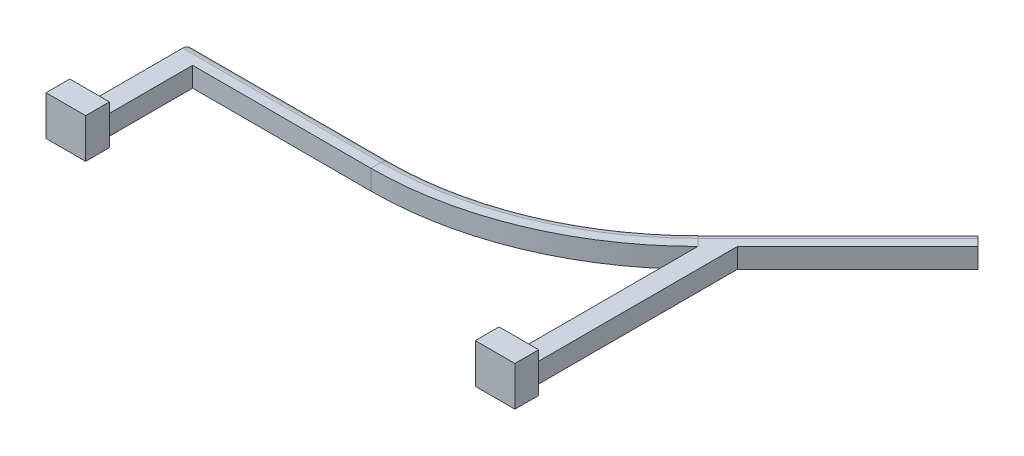
ISO-10303-21;
HEADER;
FILE_DESCRIPTION(('STEP AP214'),'2;1');
FILE_NAME('part.step','',(''),(''),'','','');
FILE_SCHEMA(('AUTOMOTIVE_DESIGN { 1 0 10303 214 1 1 1 1 }'));
ENDSEC;
DATA;
#1=APPLICATION_CONTEXT('core data for automotive mechanical design processes');
#2=APPLICATION_PROTOCOL_DEFINITION('international standard','automotive_design',2000,#1);
#3=PRODUCT_CONTEXT('',#1,'mechanical');
#4=PRODUCT('Part','Part','',(#3));
#5=PRODUCT_RELATED_PRODUCT_CATEGORY('part','',(#4));
#6=PRODUCT_DEFINITION_FORMATION('','',#4);
#7=PRODUCT_DEFINITION_CONTEXT('part definition',#1,'design');
#8=PRODUCT_DEFINITION('design','',#6,#7);
#9=PRODUCT_DEFINITION_SHAPE('','',#8);
#10=(LENGTH_UNIT() NAMED_UNIT(*) SI_UNIT(.MILLI.,.METRE.));
#11=(NAMED_UNIT(*) PLANE_ANGLE_UNIT() SI_UNIT($,.RADIAN.));
#12=(NAMED_UNIT(*) SI_UNIT($,.STERADIAN.) SOLID_ANGLE_UNIT());
#13=UNCERTAINTY_MEASURE_WITH_UNIT(LENGTH_MEASURE(1.E-05),#10,'distance_accuracy_value','');
#14=(GEOMETRIC_REPRESENTATION_CONTEXT(3) GLOBAL_UNCERTAINTY_ASSIGNED_CONTEXT((#13)) GLOBAL_UNIT_ASSIGNED_CONTEXT((#10,
#11,#12)) REPRESENTATION_CONTEXT('',''));
#15=CARTESIAN_POINT('',(0.,0.,0.));
#16=DIRECTION('',(0.,0.,1.));
#17=DIRECTION('',(1.,0.,0.));
#18=AXIS2_PLACEMENT_3D('',#15,#16,#17);
#19=CARTESIAN_POINT('',(108.33630944789,2.5,-21.6636905521099));
#20=DIRECTION('',(0.,1.,0.));
#21=DIRECTION('',(0.,0.,1.));
#22=AXIS2_PLACEMENT_3D('',#19,#20,#21);
#23=PLANE('',#22);
#24=DIRECTION('',(0.,0.,1.));
#25=VECTOR('',#24,1.);
#26=CARTESIAN_POINT('',(108.33630944789,2.5,32.));
#27=LINE('',#26,#25);
#28=CARTESIAN_POINT('',(108.33630944789,2.5,-21.6636905521099));
#29=VERTEX_POINT('',#28);
#30=CARTESIAN_POINT('',(108.33630944789,2.5,26.));
#31=VERTEX_POINT('',#30);
#32=EDGE_CURVE('E271',#29,#31,#27,.T.);
#33=ORIENTED_EDGE('',*,*,#32,.T.);
#34=DIRECTION('',(1.,0.,0.));
#35=VECTOR('',#34,1.);
#36=CARTESIAN_POINT('',(108.33630944789,2.5,26.));
#37=LINE('',#36,#35);
#38=CARTESIAN_POINT('',(113.33630944789,2.5,26.));
#39=VERTEX_POINT('',#38);
#40=EDGE_CURVE('E228',#31,#39,#37,.T.);
#41=ORIENTED_EDGE('',*,*,#40,.T.);
#42=DIRECTION('',(0.,0.,-1.));
#43=VECTOR('',#42,1.);
#44=CARTESIAN_POINT('',(113.33630944789,2.5,-26.6636905521099));
#45=LINE('',#44,#43);
#46=CARTESIAN_POINT('',(113.33630944789,2.5,-26.6636905521099));
#47=VERTEX_POINT('',#46);
#48=EDGE_CURVE('E273',#39,#47,#45,.T.);
#49=ORIENTED_EDGE('',*,*,#48,.T.);
#50=DIRECTION('',(0.707106781186546,0.,-0.707106781186549));
#51=VECTOR('',#50,1.);
#52=CARTESIAN_POINT('',(108.33630944789,2.5,-21.6636905521099));
#53=LINE('',#52,#51);
#54=CARTESIAN_POINT('',(143.691648507218,2.5,-57.0190296114374));
#55=VERTEX_POINT('',#54);
#56=EDGE_CURVE('E315',#47,#55,#53,.T.);
#57=ORIENTED_EDGE('',*,*,#56,.T.);
#58=DIRECTION('',(0.707106781186549,0.,0.707106781186546));
#59=VECTOR('',#58,1.);
#60=CARTESIAN_POINT('',(143.691648507218,2.5,-57.0190296114374));
#61=LINE('',#60,#59);
#62=CARTESIAN_POINT('',(141.923881554251,2.5,-58.7867965644037));
#63=VERTEX_POINT('',#62);
#64=EDGE_CURVE('E329',#63,#55,#61,.T.);
#65=ORIENTED_EDGE('',*,*,#64,.F.);
#66=DIRECTION('',(0.707106781186546,0.,-0.707106781186549));
#67=VECTOR('',#66,1.);
#68=CARTESIAN_POINT('',(106.568542494924,2.5,-23.4314575050763));
#69=LINE('',#68,#67);
#70=CARTESIAN_POINT('',(106.568542494924,2.5,-23.4314575050763));
#71=VERTEX_POINT('',#70);
#72=EDGE_CURVE('E347',#63,#71,#69,.F.);
#73=ORIENTED_EDGE('',*,*,#72,.T.);
#74=DIRECTION('',(0.707106781186549,0.,0.707106781186546));
#75=VECTOR('',#74,1.);
#76=CARTESIAN_POINT('',(108.33630944789,2.5,-21.6636905521099));
#77=LINE('',#76,#75);
#78=EDGE_CURVE('E319',#71,#29,#77,.T.);
#79=ORIENTED_EDGE('',*,*,#78,.T.);
#80=EDGE_LOOP('',(#33,#41,#49,#57,#65,#73,#79));
#81=FACE_BOUND('',#80,.T.);
#82=ADVANCED_FACE('F36',(#81),#23,.T.);
#83=CARTESIAN_POINT('',(108.33630944789,2.5,32.));
#84=DIRECTION('',(1.,0.,0.));
#85=DIRECTION('',(0.,0.,-1.));
#86=AXIS2_PLACEMENT_3D('',#83,#84,#85);
#87=PLANE('',#86);
#88=DIRECTION('',(0.,-1.,0.));
#89=VECTOR('',#88,1.);
#90=CARTESIAN_POINT('',(108.33630944789,2.5,26.));
#91=LINE('',#90,#89);
#92=CARTESIAN_POINT('',(108.33630944789,-2.5,26.));
#93=VERTEX_POINT('',#92);
#94=EDGE_CURVE('E51',#31,#93,#91,.T.);
#95=ORIENTED_EDGE('',*,*,#94,.F.);
#96=ORIENTED_EDGE('',*,*,#32,.F.);
#97=DIRECTION('',(0.,-1.,0.));
#98=VECTOR('',#97,1.);
#99=CARTESIAN_POINT('',(108.33630944789,2.5,-21.6636905521099));
#100=LINE('',#99,#98);
#101=CARTESIAN_POINT('',(108.33630944789,-2.5,-21.6636905521099));
#102=VERTEX_POINT('',#101);
#103=EDGE_CURVE('E301',#29,#102,#100,.T.);
#104=ORIENTED_EDGE('',*,*,#103,.T.);
#105=DIRECTION('',(0.,0.,1.));
#106=VECTOR('',#105,1.);
#107=CARTESIAN_POINT('',(108.33630944789,-2.5,32.));
#108=LINE('',#107,#106);
#109=EDGE_CURVE('E56',#102,#93,#108,.T.);
#110=ORIENTED_EDGE('',*,*,#109,.T.);
#111=EDGE_LOOP('',(#95,#96,#104,#110));
#112=FACE_BOUND('',#111,.T.);
#113=ADVANCED_FACE('F457',(#112),#87,.F.);
#114=CARTESIAN_POINT('',(113.33630944789,2.5,-26.6636905521099));
#115=DIRECTION('',(-1.,0.,0.));
#116=DIRECTION('',(0.,0.,1.));
#117=AXIS2_PLACEMENT_3D('',#114,#115,#116);
#118=PLANE('',#117);
#119=DIRECTION('',(0.,1.,0.));
#120=VECTOR('',#119,1.);
#121=CARTESIAN_POINT('',(113.33630944789,2.5,26.));
#122=LINE('',#121,#120);
#123=CARTESIAN_POINT('',(113.33630944789,-2.5,26.));
#124=VERTEX_POINT('',#123);
#125=EDGE_CURVE('E11',#124,#39,#122,.T.);
#126=ORIENTED_EDGE('',*,*,#125,.F.);
#127=DIRECTION('',(0.,0.,-1.));
#128=VECTOR('',#127,1.);
#129=CARTESIAN_POINT('',(113.33630944789,-2.5,-26.6636905521099));
#130=LINE('',#129,#128);
#131=CARTESIAN_POINT('',(113.33630944789,-2.5,-26.6636905521099));
#132=VERTEX_POINT('',#131);
#133=EDGE_CURVE('E274',#124,#132,#130,.T.);
#134=ORIENTED_EDGE('',*,*,#133,.T.);
#135=DIRECTION('',(0.,-1.,0.));
#136=VECTOR('',#135,1.);
#137=CARTESIAN_POINT('',(113.33630944789,2.5,-26.6636905521099));
#138=LINE('',#137,#136);
#139=EDGE_CURVE('E276',#47,#132,#138,.T.);
#140=ORIENTED_EDGE('',*,*,#139,.F.);
#141=ORIENTED_EDGE('',*,*,#48,.F.);
#142=EDGE_LOOP('',(#126,#134,#140,#141));
#143=FACE_BOUND('',#142,.T.);
#144=ADVANCED_FACE('F463',(#143),#118,.F.);
#145=CARTESIAN_POINT('',(0.,0.,0.));
#146=DIRECTION('',(1.,0.,0.));
#147=DIRECTION('',(0.,0.,-1.));
#148=AXIS2_PLACEMENT_3D('',#145,#146,#147);
#149=PLANE('',#148);
#150=DIRECTION('',(0.,-1.,0.));
#151=VECTOR('',#150,1.);
#152=CARTESIAN_POINT('',(0.,0.,26.));
#153=LINE('',#152,#151);
#154=CARTESIAN_POINT('',(0.,2.5,26.));
#155=VERTEX_POINT('',#154);
#156=CARTESIAN_POINT('',(0.,-2.5,26.));
#157=VERTEX_POINT('',#156);
#158=EDGE_CURVE('E268',#155,#157,#153,.T.);
#159=ORIENTED_EDGE('',*,*,#158,.F.);
#160=DIRECTION('',(0.,0.,1.));
#161=VECTOR('',#160,1.);
#162=CARTESIAN_POINT('',(0.,2.5,2.5));
#163=LINE('',#162,#161);
#164=CARTESIAN_POINT('',(0.,2.5,0.));
#165=VERTEX_POINT('',#164);
#166=EDGE_CURVE('E300',#165,#155,#163,.T.);
#167=ORIENTED_EDGE('',*,*,#166,.F.);
#168=CARTESIAN_POINT('',(0.,0.,0.));
#169=DIRECTION('',(1.,0.,0.));
#170=DIRECTION('',(0.,0.,-1.));
#171=AXIS2_PLACEMENT_3D('',#168,#169,#170);
#172=CIRCLE('',#171,2.5);
#173=CARTESIAN_POINT('',(0.,0.,-2.5));
#174=VERTEX_POINT('',#173);
#175=EDGE_CURVE('E353',#165,#174,#172,.F.);
#176=ORIENTED_EDGE('',*,*,#175,.T.);
#177=CARTESIAN_POINT('',(0.,0.,0.));
#178=DIRECTION('',(1.,0.,0.));
#179=DIRECTION('',(0.,0.,-1.));
#180=AXIS2_PLACEMENT_3D('',#177,#178,#179);
#181=CIRCLE('',#180,2.5);
#182=CARTESIAN_POINT('',(0.,-2.5,0.));
#183=VERTEX_POINT('',#182);
#184=EDGE_CURVE('E355',#174,#183,#181,.F.);
#185=ORIENTED_EDGE('',*,*,#184,.T.);
#186=DIRECTION('',(0.,0.,-1.));
#187=VECTOR('',#186,1.);
#188=CARTESIAN_POINT('',(0.,-2.5,2.5));
#189=LINE('',#188,#187);
#190=EDGE_CURVE('E320',#157,#183,#189,.T.);
#191=ORIENTED_EDGE('',*,*,#190,.F.);
#192=EDGE_LOOP('',(#159,#167,#176,#185,#191));
#193=FACE_BOUND('',#192,.T.);
#194=ADVANCED_FACE('F432',(#193),#149,.F.);
#195=CARTESIAN_POINT('',(0.,2.5,2.5));
#196=DIRECTION('',(0.,1.,0.));
#197=DIRECTION('',(0.,0.,1.));
#198=AXIS2_PLACEMENT_3D('',#195,#196,#197);
#199=PLANE('',#198);
#200=ORIENTED_EDGE('',*,*,#166,.T.);
#201=DIRECTION('',(1.,0.,0.));
#202=VECTOR('',#201,1.);
#203=CARTESIAN_POINT('',(0.,2.5,26.));
#204=LINE('',#203,#202);
#205=CARTESIAN_POINT('',(5.,2.5,26.));
#206=VERTEX_POINT('',#205);
#207=EDGE_CURVE('E259',#155,#206,#204,.T.);
#208=ORIENTED_EDGE('',*,*,#207,.T.);
#209=DIRECTION('',(0.,0.,-1.));
#210=VECTOR('',#209,1.);
#211=CARTESIAN_POINT('',(5.,2.5,32.));
#212=LINE('',#211,#210);
#213=CARTESIAN_POINT('',(5.,2.5,2.5));
#214=VERTEX_POINT('',#213);
#215=EDGE_CURVE('E283',#206,#214,#212,.T.);
#216=ORIENTED_EDGE('',*,*,#215,.T.);
#217=DIRECTION('',(1.,0.,0.));
#218=VECTOR('',#217,1.);
#219=CARTESIAN_POINT('',(0.,2.5,2.5));
#220=LINE('',#219,#218);
#221=CARTESIAN_POINT('',(50.,2.5,2.5));
#222=VERTEX_POINT('',#221);
#223=EDGE_CURVE('E296',#214,#222,#220,.T.);
#224=ORIENTED_EDGE('',*,*,#223,.T.);
#225=DIRECTION('',(0.,0.,1.));
#226=VECTOR('',#225,1.);
#227=CARTESIAN_POINT('',(50.,2.5,2.5));
#228=LINE('',#227,#226);
#229=CARTESIAN_POINT('',(50.,2.5,0.));
#230=VERTEX_POINT('',#229);
#231=EDGE_CURVE('E310',#230,#222,#228,.T.);
#232=ORIENTED_EDGE('',*,*,#231,.F.);
#233=DIRECTION('',(1.,0.,0.));
#234=VECTOR('',#233,1.);
#235=CARTESIAN_POINT('',(0.,2.5,0.));
#236=LINE('',#235,#234);
#237=EDGE_CURVE('E358',#230,#165,#236,.F.);
#238=ORIENTED_EDGE('',*,*,#237,.T.);
#239=EDGE_LOOP('',(#200,#208,#216,#224,#232,#238));
#240=FACE_BOUND('',#239,.T.);
#241=ADVANCED_FACE('F414',(#240),#199,.T.);
#242=CARTESIAN_POINT('',(5.,2.5,32.));
#243=DIRECTION('',(-1.,0.,0.));
#244=DIRECTION('',(0.,0.,1.));
#245=AXIS2_PLACEMENT_3D('',#242,#243,#244);
#246=PLANE('',#245);
#247=DIRECTION('',(0.,1.,0.));
#248=VECTOR('',#247,1.);
#249=CARTESIAN_POINT('',(5.,2.5,26.));
#250=LINE('',#249,#248);
#251=CARTESIAN_POINT('',(5.,-2.5,26.));
#252=VERTEX_POINT('',#251);
#253=EDGE_CURVE('E44',#252,#206,#250,.T.);
#254=ORIENTED_EDGE('',*,*,#253,.F.);
#255=DIRECTION('',(0.,0.,-1.));
#256=VECTOR('',#255,1.);
#257=CARTESIAN_POINT('',(5.,-2.5,32.));
#258=LINE('',#257,#256);
#259=CARTESIAN_POINT('',(5.,-2.5,2.5));
#260=VERTEX_POINT('',#259);
#261=EDGE_CURVE('E286',#252,#260,#258,.T.);
#262=ORIENTED_EDGE('',*,*,#261,.T.);
#263=DIRECTION('',(0.,-1.,0.));
#264=VECTOR('',#263,1.);
#265=CARTESIAN_POINT('',(5.,2.5,2.5));
#266=LINE('',#265,#264);
#267=EDGE_CURVE('E285',#214,#260,#266,.T.);
#268=ORIENTED_EDGE('',*,*,#267,.F.);
#269=ORIENTED_EDGE('',*,*,#215,.F.);
#270=EDGE_LOOP('',(#254,#262,#268,#269));
#271=FACE_BOUND('',#270,.T.);
#272=ADVANCED_FACE('F387',(#271),#246,.F.);
#273=CARTESIAN_POINT('',(108.33630944789,2.5,-21.6636905521099));
#274=DIRECTION('',(0.707106781186549,0.,0.707106781186546));
#275=DIRECTION('',(0.707106781186546,0.,-0.707106781186549));
#276=AXIS2_PLACEMENT_3D('',#273,#274,#275);
#277=PLANE('',#276);
#278=ORIENTED_EDGE('',*,*,#56,.F.);
#279=ORIENTED_EDGE('',*,*,#139,.T.);
#280=DIRECTION('',(0.707106781186546,0.,-0.707106781186549));
#281=VECTOR('',#280,1.);
#282=CARTESIAN_POINT('',(108.33630944789,-2.5,-21.6636905521099));
#283=LINE('',#282,#281);
#284=CARTESIAN_POINT('',(143.691648507218,-2.5,-57.0190296114374));
#285=VERTEX_POINT('',#284);
#286=EDGE_CURVE('E314',#132,#285,#283,.T.);
#287=ORIENTED_EDGE('',*,*,#286,.T.);
#288=DIRECTION('',(0.,-1.,0.));
#289=VECTOR('',#288,1.);
#290=CARTESIAN_POINT('',(143.691648507218,2.5,-57.0190296114374));
#291=LINE('',#290,#289);
#292=EDGE_CURVE('E311',#55,#285,#291,.T.);
#293=ORIENTED_EDGE('',*,*,#292,.F.);
#294=EDGE_LOOP('',(#278,#279,#287,#293));
#295=FACE_BOUND('',#294,.T.);
#296=ADVANCED_FACE('F498',(#295),#277,.T.);
#297=CARTESIAN_POINT('',(0.,2.5,2.5));
#298=DIRECTION('',(0.,0.,1.));
#299=DIRECTION('',(0.,-1.,0.));
#300=AXIS2_PLACEMENT_3D('',#297,#298,#299);
#301=PLANE('',#300);
#302=ORIENTED_EDGE('',*,*,#223,.F.);
#303=ORIENTED_EDGE('',*,*,#267,.T.);
#304=DIRECTION('',(1.,0.,0.));
#305=VECTOR('',#304,1.);
#306=CARTESIAN_POINT('',(0.,-2.5,2.5));
#307=LINE('',#306,#305);
#308=CARTESIAN_POINT('',(50.,-2.5,2.5));
#309=VERTEX_POINT('',#308);
#310=EDGE_CURVE('E295',#260,#309,#307,.T.);
#311=ORIENTED_EDGE('',*,*,#310,.T.);
#312=DIRECTION('',(0.,-1.,0.));
#313=VECTOR('',#312,1.);
#314=CARTESIAN_POINT('',(50.,2.5,2.5));
#315=LINE('',#314,#313);
#316=EDGE_CURVE('E292',#222,#309,#315,.T.);
#317=ORIENTED_EDGE('',*,*,#316,.F.);
#318=EDGE_LOOP('',(#302,#303,#311,#317));
#319=FACE_BOUND('',#318,.T.);
#320=ADVANCED_FACE('F398',(#319),#301,.T.);
#321=CARTESIAN_POINT('',(141.923881554251,0.,-58.7867965644037));
#322=DIRECTION('',(0.707106781186546,0.,-0.707106781186549));
#323=DIRECTION('',(-0.707106781186549,0.,-0.707106781186546));
#324=AXIS2_PLACEMENT_3D('',#321,#322,#323);
#325=PLANE('',#324);
#326=DIRECTION('',(-0.707106781186549,0.,-0.707106781186546));
#327=VECTOR('',#326,1.);
#328=CARTESIAN_POINT('',(143.691648507218,-2.5,-57.0190296114374));
#329=LINE('',#328,#327);
#330=CARTESIAN_POINT('',(141.923881554251,-2.5,-58.7867965644037));
#331=VERTEX_POINT('',#330);
#332=EDGE_CURVE('E317',#285,#331,#329,.T.);
#333=ORIENTED_EDGE('',*,*,#332,.T.);
#334=CARTESIAN_POINT('',(141.923881554251,0.,-58.7867965644037));
#335=DIRECTION('',(0.707106781186546,0.,-0.707106781186549));
#336=DIRECTION('',(-0.707106781186549,0.,-0.707106781186546));
#337=AXIS2_PLACEMENT_3D('',#334,#335,#336);
#338=CIRCLE('',#337,2.5);
#339=CARTESIAN_POINT('',(140.156114601285,0.,-60.5545635173701));
#340=VERTEX_POINT('',#339);
#341=EDGE_CURVE('E343',#331,#340,#338,.T.);
#342=ORIENTED_EDGE('',*,*,#341,.T.);
#343=CARTESIAN_POINT('',(141.923881554251,0.,-58.7867965644037));
#344=DIRECTION('',(0.707106781186546,0.,-0.707106781186549));
#345=DIRECTION('',(-0.707106781186549,0.,-0.707106781186546));
#346=AXIS2_PLACEMENT_3D('',#343,#344,#345);
#347=CIRCLE('',#346,2.5);
#348=EDGE_CURVE('E341',#340,#63,#347,.T.);
#349=ORIENTED_EDGE('',*,*,#348,.T.);
#350=ORIENTED_EDGE('',*,*,#64,.T.);
#351=ORIENTED_EDGE('',*,*,#292,.T.);
#352=EDGE_LOOP('',(#333,#342,#349,#350,#351));
#353=FACE_BOUND('',#352,.T.);
#354=ADVANCED_FACE('F468',(#353),#325,.T.);
#355=CARTESIAN_POINT('',(0.,-2.5,2.5));
#356=DIRECTION('',(0.,-1.,0.));
#357=DIRECTION('',(0.,0.,-1.));
#358=AXIS2_PLACEMENT_3D('',#355,#356,#357);
#359=PLANE('',#358);
#360=DIRECTION('',(1.,0.,0.));
#361=VECTOR('',#360,1.);
#362=CARTESIAN_POINT('',(0.,-2.5,32.));
#363=LINE('',#362,#361);
#364=CARTESIAN_POINT('',(-2.5,-2.5,32.));
#365=VERTEX_POINT('',#364);
#366=CARTESIAN_POINT('',(7.5,-2.5,32.));
#367=VERTEX_POINT('',#366);
#368=EDGE_CURVE('E282',#365,#367,#363,.T.);
#369=ORIENTED_EDGE('',*,*,#368,.F.);
#370=DIRECTION('',(0.,0.,1.));
#371=VECTOR('',#370,1.);
#372=CARTESIAN_POINT('',(-2.5,-2.5,26.));
#373=LINE('',#372,#371);
#374=CARTESIAN_POINT('',(-2.5,-2.5,26.));
#375=VERTEX_POINT('',#374);
#376=EDGE_CURVE('E249',#375,#365,#373,.T.);
#377=ORIENTED_EDGE('',*,*,#376,.F.);
#378=DIRECTION('',(1.,0.,0.));
#379=VECTOR('',#378,1.);
#380=CARTESIAN_POINT('',(-2.5,-2.5,26.));
#381=LINE('',#380,#379);
#382=EDGE_CURVE('E240',#375,#157,#381,.T.);
#383=ORIENTED_EDGE('',*,*,#382,.T.);
#384=ORIENTED_EDGE('',*,*,#190,.T.);
#385=DIRECTION('',(1.,0.,0.));
#386=VECTOR('',#385,1.);
#387=CARTESIAN_POINT('',(0.,-2.5,0.));
#388=LINE('',#387,#386);
#389=CARTESIAN_POINT('',(50.,-2.5,0.));
#390=VERTEX_POINT('',#389);
#391=EDGE_CURVE('E351',#183,#390,#388,.T.);
#392=ORIENTED_EDGE('',*,*,#391,.T.);
#393=DIRECTION('',(0.,0.,-1.));
#394=VECTOR('',#393,1.);
#395=CARTESIAN_POINT('',(50.,-2.5,2.5));
#396=LINE('',#395,#394);
#397=EDGE_CURVE('E298',#309,#390,#396,.T.);
#398=ORIENTED_EDGE('',*,*,#397,.F.);
#399=ORIENTED_EDGE('',*,*,#310,.F.);
#400=ORIENTED_EDGE('',*,*,#261,.F.);
#401=CARTESIAN_POINT('',(7.5,-2.5,26.));
#402=VERTEX_POINT('',#401);
#403=EDGE_CURVE('E238',#252,#402,#381,.T.);
#404=ORIENTED_EDGE('',*,*,#403,.T.);
#405=DIRECTION('',(0.,0.,1.));
#406=VECTOR('',#405,1.);
#407=CARTESIAN_POINT('',(7.5,-2.5,26.));
#408=LINE('',#407,#406);
#409=EDGE_CURVE('E262',#402,#367,#408,.T.);
#410=ORIENTED_EDGE('',*,*,#409,.T.);
#411=EDGE_LOOP('',(#369,#377,#383,#384,#392,#398,#399,#400,#404,#410));
#412=FACE_BOUND('',#411,.T.);
#413=ADVANCED_FACE('F391',(#412),#359,.T.);
#414=CARTESIAN_POINT('',(50.,0.,-80.));
#415=DIRECTION('',(0.,1.,0.));
#416=DIRECTION('',(0.,0.,1.));
#417=AXIS2_PLACEMENT_3D('',#414,#415,#416);
#418=CYLINDRICAL_SURFACE('',#417,82.5);
#419=CARTESIAN_POINT('',(50.,-2.5,-80.));
#420=DIRECTION('',(0.,1.,0.));
#421=DIRECTION('',(0.,0.,1.));
#422=AXIS2_PLACEMENT_3D('',#419,#420,#421);
#423=CIRCLE('',#422,82.5);
#424=EDGE_CURVE('E303',#309,#102,#423,.T.);
#425=ORIENTED_EDGE('',*,*,#424,.T.);
#426=ORIENTED_EDGE('',*,*,#103,.F.);
#427=CARTESIAN_POINT('',(50.,2.5,-80.));
#428=DIRECTION('',(0.,1.,0.));
#429=DIRECTION('',(0.,0.,1.));
#430=AXIS2_PLACEMENT_3D('',#427,#428,#429);
#431=CIRCLE('',#430,82.5);
#432=EDGE_CURVE('E304',#222,#29,#431,.T.);
#433=ORIENTED_EDGE('',*,*,#432,.F.);
#434=ORIENTED_EDGE('',*,*,#316,.T.);
#435=EDGE_LOOP('',(#425,#426,#433,#434));
#436=FACE_BOUND('',#435,.T.);
#437=ADVANCED_FACE('F405',(#436),#418,.T.);
#438=CARTESIAN_POINT('',(50.,-2.5,2.50000000000001));
#439=DIRECTION('',(0.,-1.,0.));
#440=DIRECTION('',(0.,0.,-1.));
#441=AXIS2_PLACEMENT_3D('',#438,#439,#440);
#442=PLANE('',#441);
#443=ORIENTED_EDGE('',*,*,#397,.T.);
#444=CARTESIAN_POINT('',(50.,-2.5,-80.));
#445=DIRECTION('',(0.,-1.,0.));
#446=DIRECTION('',(0.,0.,-1.));
#447=AXIS2_PLACEMENT_3D('',#444,#445,#446);
#448=CIRCLE('',#447,80.);
#449=CARTESIAN_POINT('',(106.568542494924,-2.5,-23.4314575050763));
#450=VERTEX_POINT('',#449);
#451=EDGE_CURVE('E345',#390,#450,#448,.F.);
#452=ORIENTED_EDGE('',*,*,#451,.T.);
#453=DIRECTION('',(-0.707106781186549,0.,-0.707106781186546));
#454=VECTOR('',#453,1.);
#455=CARTESIAN_POINT('',(108.33630944789,-2.5,-21.6636905521099));
#456=LINE('',#455,#454);
#457=EDGE_CURVE('E307',#102,#450,#456,.T.);
#458=ORIENTED_EDGE('',*,*,#457,.F.);
#459=ORIENTED_EDGE('',*,*,#424,.F.);
#460=EDGE_LOOP('',(#443,#452,#458,#459));
#461=FACE_BOUND('',#460,.T.);
#462=ADVANCED_FACE('F401',(#461),#442,.T.);
#463=CARTESIAN_POINT('',(50.,2.5,2.50000000000001));
#464=DIRECTION('',(0.,1.,0.));
#465=DIRECTION('',(0.,0.,1.));
#466=AXIS2_PLACEMENT_3D('',#463,#464,#465);
#467=PLANE('',#466);
#468=ORIENTED_EDGE('',*,*,#78,.F.);
#469=CARTESIAN_POINT('',(50.,2.5,-80.));
#470=DIRECTION('',(0.,1.,0.));
#471=DIRECTION('',(0.,0.,1.));
#472=AXIS2_PLACEMENT_3D('',#469,#470,#471);
#473=CIRCLE('',#472,80.);
#474=EDGE_CURVE('E349',#71,#230,#473,.F.);
#475=ORIENTED_EDGE('',*,*,#474,.T.);
#476=ORIENTED_EDGE('',*,*,#231,.T.);
#477=ORIENTED_EDGE('',*,*,#432,.T.);
#478=EDGE_LOOP('',(#468,#475,#476,#477));
#479=FACE_BOUND('',#478,.T.);
#480=ADVANCED_FACE('F409',(#479),#467,.T.);
#481=CARTESIAN_POINT('',(108.33630944789,-2.5,-21.6636905521099));
#482=DIRECTION('',(0.,-1.,0.));
#483=DIRECTION('',(0.,0.,-1.));
#484=AXIS2_PLACEMENT_3D('',#481,#482,#483);
#485=PLANE('',#484);
#486=DIRECTION('',(1.,0.,0.));
#487=VECTOR('',#486,1.);
#488=CARTESIAN_POINT('',(105.83630944789,-2.5,26.));
#489=LINE('',#488,#487);
#490=CARTESIAN_POINT('',(105.83630944789,-2.5,26.));
#491=VERTEX_POINT('',#490);
#492=EDGE_CURVE('E192',#491,#93,#489,.T.);
#493=ORIENTED_EDGE('',*,*,#492,.T.);
#494=ORIENTED_EDGE('',*,*,#109,.F.);
#495=ORIENTED_EDGE('',*,*,#457,.T.);
#496=DIRECTION('',(0.707106781186546,0.,-0.707106781186549));
#497=VECTOR('',#496,1.);
#498=CARTESIAN_POINT('',(106.568542494924,-2.5,-23.4314575050763));
#499=LINE('',#498,#497);
#500=EDGE_CURVE('E338',#450,#331,#499,.T.);
#501=ORIENTED_EDGE('',*,*,#500,.T.);
#502=ORIENTED_EDGE('',*,*,#332,.F.);
#503=ORIENTED_EDGE('',*,*,#286,.F.);
#504=ORIENTED_EDGE('',*,*,#133,.F.);
#505=CARTESIAN_POINT('',(115.83630944789,-2.5,26.));
#506=VERTEX_POINT('',#505);
#507=EDGE_CURVE('E210',#124,#506,#489,.T.);
#508=ORIENTED_EDGE('',*,*,#507,.T.);
#509=DIRECTION('',(0.,0.,1.));
#510=VECTOR('',#509,1.);
#511=CARTESIAN_POINT('',(115.83630944789,-2.5,26.));
#512=LINE('',#511,#510);
#513=CARTESIAN_POINT('',(115.83630944789,-2.5,32.));
#514=VERTEX_POINT('',#513);
#515=EDGE_CURVE('E199',#506,#514,#512,.T.);
#516=ORIENTED_EDGE('',*,*,#515,.T.);
#517=DIRECTION('',(1.,0.,0.));
#518=VECTOR('',#517,1.);
#519=CARTESIAN_POINT('',(113.33630944789,-2.5,32.));
#520=LINE('',#519,#518);
#521=CARTESIAN_POINT('',(105.83630944789,-2.5,32.));
#522=VERTEX_POINT('',#521);
#523=EDGE_CURVE('E194',#522,#514,#520,.T.);
#524=ORIENTED_EDGE('',*,*,#523,.F.);
#525=DIRECTION('',(0.,0.,1.));
#526=VECTOR('',#525,1.);
#527=CARTESIAN_POINT('',(105.83630944789,-2.5,26.));
#528=LINE('',#527,#526);
#529=EDGE_CURVE('E189',#491,#522,#528,.T.);
#530=ORIENTED_EDGE('',*,*,#529,.F.);
#531=EDGE_LOOP('',(#493,#494,#495,#501,#502,#503,#504,#508,#516,#524,#530));
#532=FACE_BOUND('',#531,.T.);
#533=ADVANCED_FACE('F191',(#532),#485,.T.);
#534=CARTESIAN_POINT('',(0.,0.,0.));
#535=DIRECTION('',(1.,0.,0.));
#536=DIRECTION('',(0.,0.,-1.));
#537=AXIS2_PLACEMENT_3D('',#534,#535,#536);
#538=CYLINDRICAL_SURFACE('',#537,2.5);
#539=ORIENTED_EDGE('',*,*,#175,.F.);
#540=ORIENTED_EDGE('',*,*,#237,.F.);
#541=CARTESIAN_POINT('',(50.,0.,0.));
#542=DIRECTION('',(1.,0.,0.));
#543=DIRECTION('',(0.,0.,-1.));
#544=AXIS2_PLACEMENT_3D('',#541,#542,#543);
#545=CIRCLE('',#544,2.5);
#546=CARTESIAN_POINT('',(50.,0.,-2.49999999999999));
#547=VERTEX_POINT('',#546);
#548=EDGE_CURVE('E322',#547,#230,#545,.T.);
#549=ORIENTED_EDGE('',*,*,#548,.F.);
#550=DIRECTION('',(1.,0.,0.));
#551=VECTOR('',#550,1.);
#552=CARTESIAN_POINT('',(0.,0.,-2.5));
#553=LINE('',#552,#551);
#554=EDGE_CURVE('E374',#174,#547,#553,.T.);
#555=ORIENTED_EDGE('',*,*,#554,.F.);
#556=EDGE_LOOP('',(#539,#540,#549,#555));
#557=FACE_BOUND('',#556,.T.);
#558=ADVANCED_FACE('F38',(#557),#538,.T.);
#559=CARTESIAN_POINT('',(50.,0.,-80.));
#560=DIRECTION('',(0.,1.,0.));
#561=DIRECTION('',(0.,0.,1.));
#562=AXIS2_PLACEMENT_3D('',#559,#560,#561);
#563=TOROIDAL_SURFACE('',#562,80.,2.5);
#564=ORIENTED_EDGE('',*,*,#548,.T.);
#565=ORIENTED_EDGE('',*,*,#474,.F.);
#566=CARTESIAN_POINT('',(106.568542494924,0.,-23.4314575050763));
#567=DIRECTION('',(0.707106781186546,0.,-0.70710678118655));
#568=DIRECTION('',(-0.70710678118655,0.,-0.707106781186546));
#569=AXIS2_PLACEMENT_3D('',#566,#567,#568);
#570=CIRCLE('',#569,2.5);
#571=CARTESIAN_POINT('',(104.800775541958,0.,-25.1992244580427));
#572=VERTEX_POINT('',#571);
#573=EDGE_CURVE('E371',#572,#71,#570,.T.);
#574=ORIENTED_EDGE('',*,*,#573,.F.);
#575=CARTESIAN_POINT('',(50.,0.,-80.));
#576=DIRECTION('',(0.,1.,0.));
#577=DIRECTION('',(0.,0.,1.));
#578=AXIS2_PLACEMENT_3D('',#575,#576,#577);
#579=CIRCLE('',#578,77.5);
#580=EDGE_CURVE('E368',#547,#572,#579,.T.);
#581=ORIENTED_EDGE('',*,*,#580,.F.);
#582=EDGE_LOOP('',(#564,#565,#574,#581));
#583=FACE_BOUND('',#582,.T.);
#584=ADVANCED_FACE('F421',(#583),#563,.T.);
#585=CARTESIAN_POINT('',(0.,0.,0.));
#586=DIRECTION('',(1.,0.,0.));
#587=DIRECTION('',(0.,0.,-1.));
#588=AXIS2_PLACEMENT_3D('',#585,#586,#587);
#589=CYLINDRICAL_SURFACE('',#588,2.5);
#590=ORIENTED_EDGE('',*,*,#184,.F.);
#591=ORIENTED_EDGE('',*,*,#554,.T.);
#592=CARTESIAN_POINT('',(50.,0.,0.));
#593=DIRECTION('',(1.,0.,0.));
#594=DIRECTION('',(0.,0.,-1.));
#595=AXIS2_PLACEMENT_3D('',#592,#593,#594);
#596=CIRCLE('',#595,2.5);
#597=EDGE_CURVE('E365',#390,#547,#596,.T.);
#598=ORIENTED_EDGE('',*,*,#597,.F.);
#599=ORIENTED_EDGE('',*,*,#391,.F.);
#600=EDGE_LOOP('',(#590,#591,#598,#599));
#601=FACE_BOUND('',#600,.T.);
#602=ADVANCED_FACE('F430',(#601),#589,.T.);
#603=CARTESIAN_POINT('',(106.568542494924,0.,-23.4314575050763));
#604=DIRECTION('',(0.707106781186546,0.,-0.707106781186549));
#605=DIRECTION('',(-0.707106781186549,0.,-0.707106781186546));
#606=AXIS2_PLACEMENT_3D('',#603,#604,#605);
#607=CYLINDRICAL_SURFACE('',#606,2.5);
#608=ORIENTED_EDGE('',*,*,#72,.F.);
#609=ORIENTED_EDGE('',*,*,#348,.F.);
#610=DIRECTION('',(0.707106781186546,0.,-0.707106781186549));
#611=VECTOR('',#610,1.);
#612=CARTESIAN_POINT('',(104.800775541958,0.,-25.1992244580427));
#613=LINE('',#612,#611);
#614=EDGE_CURVE('E362',#572,#340,#613,.T.);
#615=ORIENTED_EDGE('',*,*,#614,.F.);
#616=ORIENTED_EDGE('',*,*,#573,.T.);
#617=EDGE_LOOP('',(#608,#609,#615,#616));
#618=FACE_BOUND('',#617,.T.);
#619=ADVANCED_FACE('F480',(#618),#607,.T.);
#620=CARTESIAN_POINT('',(50.,0.,-80.));
#621=DIRECTION('',(0.,-1.,0.));
#622=DIRECTION('',(0.,0.,-1.));
#623=AXIS2_PLACEMENT_3D('',#620,#621,#622);
#624=TOROIDAL_SURFACE('',#623,80.,2.5);
#625=ORIENTED_EDGE('',*,*,#597,.T.);
#626=ORIENTED_EDGE('',*,*,#580,.T.);
#627=CARTESIAN_POINT('',(106.568542494924,0.,-23.4314575050763));
#628=DIRECTION('',(0.707106781186545,0.,-0.70710678118655));
#629=DIRECTION('',(-0.70710678118655,0.,-0.707106781186545));
#630=AXIS2_PLACEMENT_3D('',#627,#628,#629);
#631=CIRCLE('',#630,2.5);
#632=EDGE_CURVE('E291',#450,#572,#631,.T.);
#633=ORIENTED_EDGE('',*,*,#632,.F.);
#634=ORIENTED_EDGE('',*,*,#451,.F.);
#635=EDGE_LOOP('',(#625,#626,#633,#634));
#636=FACE_BOUND('',#635,.T.);
#637=ADVANCED_FACE('F426',(#636),#624,.T.);
#638=CARTESIAN_POINT('',(106.568542494924,0.,-23.4314575050763));
#639=DIRECTION('',(0.707106781186546,0.,-0.707106781186549));
#640=DIRECTION('',(-0.707106781186549,0.,-0.707106781186546));
#641=AXIS2_PLACEMENT_3D('',#638,#639,#640);
#642=CYLINDRICAL_SURFACE('',#641,2.5);
#643=ORIENTED_EDGE('',*,*,#632,.T.);
#644=ORIENTED_EDGE('',*,*,#614,.T.);
#645=ORIENTED_EDGE('',*,*,#341,.F.);
#646=ORIENTED_EDGE('',*,*,#500,.F.);
#647=EDGE_LOOP('',(#643,#644,#645,#646));
#648=FACE_BOUND('',#647,.T.);
#649=ADVANCED_FACE('F474',(#648),#642,.T.);
#650=CARTESIAN_POINT('',(0.,2.5,32.));
#651=DIRECTION('',(0.,0.,-1.));
#652=DIRECTION('',(-1.,0.,0.));
#653=AXIS2_PLACEMENT_3D('',#650,#651,#652);
#654=PLANE('',#653);
#655=DIRECTION('',(0.,-1.,0.));
#656=VECTOR('',#655,1.);
#657=CARTESIAN_POINT('',(-2.5,7.5,32.));
#658=LINE('',#657,#656);
#659=CARTESIAN_POINT('',(-2.5,7.5,32.));
#660=VERTEX_POINT('',#659);
#661=EDGE_CURVE('E234',#660,#365,#658,.T.);
#662=ORIENTED_EDGE('',*,*,#661,.T.);
#663=ORIENTED_EDGE('',*,*,#368,.T.);
#664=DIRECTION('',(0.,1.,0.));
#665=VECTOR('',#664,1.);
#666=CARTESIAN_POINT('',(7.5,7.5,32.));
#667=LINE('',#666,#665);
#668=CARTESIAN_POINT('',(7.5,7.5,32.));
#669=VERTEX_POINT('',#668);
#670=EDGE_CURVE('E252',#367,#669,#667,.T.);
#671=ORIENTED_EDGE('',*,*,#670,.T.);
#672=DIRECTION('',(-1.,0.,0.));
#673=VECTOR('',#672,1.);
#674=CARTESIAN_POINT('',(-2.5,7.5,32.));
#675=LINE('',#674,#673);
#676=EDGE_CURVE('E239',#669,#660,#675,.T.);
#677=ORIENTED_EDGE('',*,*,#676,.T.);
#678=EDGE_LOOP('',(#662,#663,#671,#677));
#679=FACE_BOUND('',#678,.T.);
#680=ADVANCED_FACE('F439',(#679),#654,.F.);
#681=CARTESIAN_POINT('',(113.33630944789,2.5,32.));
#682=DIRECTION('',(0.,0.,-1.));
#683=DIRECTION('',(-1.,0.,0.));
#684=AXIS2_PLACEMENT_3D('',#681,#682,#683);
#685=PLANE('',#684);
#686=DIRECTION('',(0.,-1.,0.));
#687=VECTOR('',#686,1.);
#688=CARTESIAN_POINT('',(105.83630944789,7.5,32.));
#689=LINE('',#688,#687);
#690=CARTESIAN_POINT('',(105.83630944789,7.5,32.));
#691=VERTEX_POINT('',#690);
#692=EDGE_CURVE('E223',#691,#522,#689,.T.);
#693=ORIENTED_EDGE('',*,*,#692,.T.);
#694=ORIENTED_EDGE('',*,*,#523,.T.);
#695=DIRECTION('',(0.,1.,0.));
#696=VECTOR('',#695,1.);
#697=CARTESIAN_POINT('',(115.83630944789,7.5,32.));
#698=LINE('',#697,#696);
#699=CARTESIAN_POINT('',(115.83630944789,7.5,32.));
#700=VERTEX_POINT('',#699);
#701=EDGE_CURVE('E217',#514,#700,#698,.T.);
#702=ORIENTED_EDGE('',*,*,#701,.T.);
#703=DIRECTION('',(-1.,0.,0.));
#704=VECTOR('',#703,1.);
#705=CARTESIAN_POINT('',(105.83630944789,7.5,32.));
#706=LINE('',#705,#704);
#707=EDGE_CURVE('E214',#700,#691,#706,.T.);
#708=ORIENTED_EDGE('',*,*,#707,.T.);
#709=EDGE_LOOP('',(#693,#694,#702,#708));
#710=FACE_BOUND('',#709,.T.);
#711=ADVANCED_FACE('F585',(#710),#685,.F.);
#712=CARTESIAN_POINT('',(0.,0.,26.));
#713=DIRECTION('',(0.,0.,1.));
#714=DIRECTION('',(1.,0.,0.));
#715=AXIS2_PLACEMENT_3D('',#712,#713,#714);
#716=PLANE('',#715);
#717=ORIENTED_EDGE('',*,*,#207,.F.);
#718=ORIENTED_EDGE('',*,*,#158,.T.);
#719=ORIENTED_EDGE('',*,*,#382,.F.);
#720=DIRECTION('',(0.,-1.,0.));
#721=VECTOR('',#720,1.);
#722=CARTESIAN_POINT('',(-2.5,7.5,26.));
#723=LINE('',#722,#721);
#724=CARTESIAN_POINT('',(-2.5,7.5,26.));
#725=VERTEX_POINT('',#724);
#726=EDGE_CURVE('E235',#725,#375,#723,.T.);
#727=ORIENTED_EDGE('',*,*,#726,.F.);
#728=DIRECTION('',(-1.,0.,0.));
#729=VECTOR('',#728,1.);
#730=CARTESIAN_POINT('',(-2.5,7.5,26.));
#731=LINE('',#730,#729);
#732=CARTESIAN_POINT('',(7.5,7.5,26.));
#733=VERTEX_POINT('',#732);
#734=EDGE_CURVE('E246',#733,#725,#731,.T.);
#735=ORIENTED_EDGE('',*,*,#734,.F.);
#736=DIRECTION('',(0.,1.,0.));
#737=VECTOR('',#736,1.);
#738=CARTESIAN_POINT('',(7.5,7.5,26.));
#739=LINE('',#738,#737);
#740=EDGE_CURVE('E243',#402,#733,#739,.T.);
#741=ORIENTED_EDGE('',*,*,#740,.F.);
#742=ORIENTED_EDGE('',*,*,#403,.F.);
#743=ORIENTED_EDGE('',*,*,#253,.T.);
#744=EDGE_LOOP('',(#717,#718,#719,#727,#735,#741,#742,#743));
#745=FACE_BOUND('',#744,.T.);
#746=ADVANCED_FACE('F382',(#745),#716,.F.);
#747=CARTESIAN_POINT('',(-2.5,7.5,26.));
#748=DIRECTION('',(-1.,0.,0.));
#749=DIRECTION('',(0.,-1.,0.));
#750=AXIS2_PLACEMENT_3D('',#747,#748,#749);
#751=PLANE('',#750);
#752=ORIENTED_EDGE('',*,*,#661,.F.);
#753=DIRECTION('',(0.,0.,1.));
#754=VECTOR('',#753,1.);
#755=CARTESIAN_POINT('',(-2.5,7.5,26.));
#756=LINE('',#755,#754);
#757=EDGE_CURVE('E257',#725,#660,#756,.T.);
#758=ORIENTED_EDGE('',*,*,#757,.F.);
#759=ORIENTED_EDGE('',*,*,#726,.T.);
#760=ORIENTED_EDGE('',*,*,#376,.T.);
#761=EDGE_LOOP('',(#752,#758,#759,#760));
#762=FACE_BOUND('',#761,.T.);
#763=ADVANCED_FACE('F437',(#762),#751,.T.);
#764=CARTESIAN_POINT('',(-2.5,7.5,26.));
#765=DIRECTION('',(0.,1.,0.));
#766=DIRECTION('',(0.,0.,1.));
#767=AXIS2_PLACEMENT_3D('',#764,#765,#766);
#768=PLANE('',#767);
#769=ORIENTED_EDGE('',*,*,#676,.F.);
#770=DIRECTION('',(0.,0.,1.));
#771=VECTOR('',#770,1.);
#772=CARTESIAN_POINT('',(7.5,7.5,26.));
#773=LINE('',#772,#771);
#774=EDGE_CURVE('E260',#733,#669,#773,.T.);
#775=ORIENTED_EDGE('',*,*,#774,.F.);
#776=ORIENTED_EDGE('',*,*,#734,.T.);
#777=ORIENTED_EDGE('',*,*,#757,.T.);
#778=EDGE_LOOP('',(#769,#775,#776,#777));
#779=FACE_BOUND('',#778,.T.);
#780=ADVANCED_FACE('F443',(#779),#768,.T.);
#781=CARTESIAN_POINT('',(7.5,7.5,26.));
#782=DIRECTION('',(1.,0.,0.));
#783=DIRECTION('',(0.,0.,-1.));
#784=AXIS2_PLACEMENT_3D('',#781,#782,#783);
#785=PLANE('',#784);
#786=ORIENTED_EDGE('',*,*,#670,.F.);
#787=ORIENTED_EDGE('',*,*,#409,.F.);
#788=ORIENTED_EDGE('',*,*,#740,.T.);
#789=ORIENTED_EDGE('',*,*,#774,.T.);
#790=EDGE_LOOP('',(#786,#787,#788,#789));
#791=FACE_BOUND('',#790,.T.);
#792=ADVANCED_FACE('F446',(#791),#785,.T.);
#793=CARTESIAN_POINT('',(0.,0.,26.));
#794=DIRECTION('',(0.,0.,1.));
#795=DIRECTION('',(1.,0.,0.));
#796=AXIS2_PLACEMENT_3D('',#793,#794,#795);
#797=PLANE('',#796);
#798=ORIENTED_EDGE('',*,*,#40,.F.);
#799=ORIENTED_EDGE('',*,*,#94,.T.);
#800=ORIENTED_EDGE('',*,*,#492,.F.);
#801=DIRECTION('',(0.,-1.,0.));
#802=VECTOR('',#801,1.);
#803=CARTESIAN_POINT('',(105.83630944789,7.5,26.));
#804=LINE('',#803,#802);
#805=CARTESIAN_POINT('',(105.83630944789,7.5,26.));
#806=VERTEX_POINT('',#805);
#807=EDGE_CURVE('E207',#806,#491,#804,.T.);
#808=ORIENTED_EDGE('',*,*,#807,.F.);
#809=DIRECTION('',(-1.,0.,0.));
#810=VECTOR('',#809,1.);
#811=CARTESIAN_POINT('',(105.83630944789,7.5,26.));
#812=LINE('',#811,#810);
#813=CARTESIAN_POINT('',(115.83630944789,7.5,26.));
#814=VERTEX_POINT('',#813);
#815=EDGE_CURVE('E200',#814,#806,#812,.T.);
#816=ORIENTED_EDGE('',*,*,#815,.F.);
#817=DIRECTION('',(0.,1.,0.));
#818=VECTOR('',#817,1.);
#819=CARTESIAN_POINT('',(115.83630944789,7.5,26.));
#820=LINE('',#819,#818);
#821=EDGE_CURVE('E209',#506,#814,#820,.T.);
#822=ORIENTED_EDGE('',*,*,#821,.F.);
#823=ORIENTED_EDGE('',*,*,#507,.F.);
#824=ORIENTED_EDGE('',*,*,#125,.T.);
#825=EDGE_LOOP('',(#798,#799,#800,#808,#816,#822,#823,#824));
#826=FACE_BOUND('',#825,.T.);
#827=ADVANCED_FACE('F205',(#826),#797,.F.);
#828=CARTESIAN_POINT('',(105.83630944789,7.5,26.));
#829=DIRECTION('',(-1.,0.,0.));
#830=DIRECTION('',(0.,0.,1.));
#831=AXIS2_PLACEMENT_3D('',#828,#829,#830);
#832=PLANE('',#831);
#833=ORIENTED_EDGE('',*,*,#692,.F.);
#834=DIRECTION('',(0.,0.,1.));
#835=VECTOR('',#834,1.);
#836=CARTESIAN_POINT('',(105.83630944789,7.5,26.));
#837=LINE('',#836,#835);
#838=EDGE_CURVE('E213',#806,#691,#837,.T.);
#839=ORIENTED_EDGE('',*,*,#838,.F.);
#840=ORIENTED_EDGE('',*,*,#807,.T.);
#841=ORIENTED_EDGE('',*,*,#529,.T.);
#842=EDGE_LOOP('',(#833,#839,#840,#841));
#843=FACE_BOUND('',#842,.T.);
#844=ADVANCED_FACE('F212',(#843),#832,.T.);
#845=CARTESIAN_POINT('',(105.83630944789,7.5,26.));
#846=DIRECTION('',(0.,1.,0.));
#847=DIRECTION('',(0.,0.,1.));
#848=AXIS2_PLACEMENT_3D('',#845,#846,#847);
#849=PLANE('',#848);
#850=ORIENTED_EDGE('',*,*,#707,.F.);
#851=DIRECTION('',(0.,0.,1.));
#852=VECTOR('',#851,1.);
#853=CARTESIAN_POINT('',(115.83630944789,7.5,26.));
#854=LINE('',#853,#852);
#855=EDGE_CURVE('E229',#814,#700,#854,.T.);
#856=ORIENTED_EDGE('',*,*,#855,.F.);
#857=ORIENTED_EDGE('',*,*,#815,.T.);
#858=ORIENTED_EDGE('',*,*,#838,.T.);
#859=EDGE_LOOP('',(#850,#856,#857,#858));
#860=FACE_BOUND('',#859,.T.);
#861=ADVANCED_FACE('F634',(#860),#849,.T.);
#862=CARTESIAN_POINT('',(115.83630944789,7.5,26.));
#863=DIRECTION('',(1.,0.,0.));
#864=DIRECTION('',(0.,0.,-1.));
#865=AXIS2_PLACEMENT_3D('',#862,#863,#864);
#866=PLANE('',#865);
#867=ORIENTED_EDGE('',*,*,#701,.F.);
#868=ORIENTED_EDGE('',*,*,#515,.F.);
#869=ORIENTED_EDGE('',*,*,#821,.T.);
#870=ORIENTED_EDGE('',*,*,#855,.T.);
#871=EDGE_LOOP('',(#867,#868,#869,#870));
#872=FACE_BOUND('',#871,.T.);
#873=ADVANCED_FACE('F643',(#872),#866,.T.);
#874=CLOSED_SHELL('',(#82,#113,#144,#194,#241,#272,#296,#320,#354,#413,#437,#462,#480,#533,#558,
#584,#602,#619,#637,#649,#680,#711,#746,#763,#780,#792,#827,#844,#861,#873));
#875=MANIFOLD_SOLID_BREP('B2',#874);
#876=ADVANCED_BREP_SHAPE_REPRESENTATION('',(#18,#875),#14);
#877=SHAPE_DEFINITION_REPRESENTATION(#9,#876);
ENDSEC;
END-ISO-10303-21;
